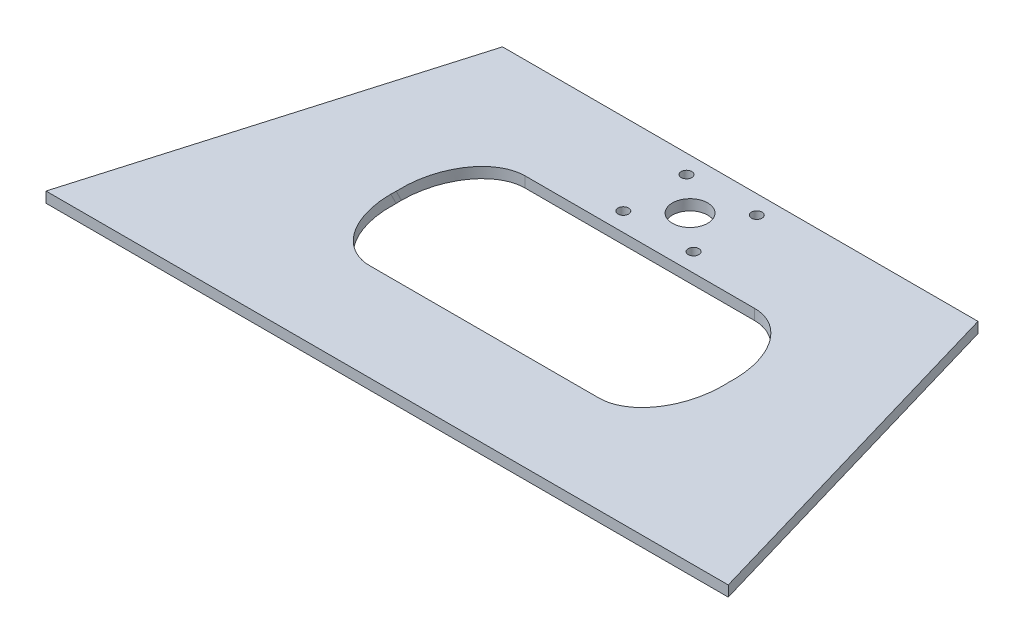
ISO-10303-21;
HEADER;
FILE_DESCRIPTION(('STEP AP214'),'2;1');
FILE_NAME('part.step','',(''),(''),'','','');
FILE_SCHEMA(('AUTOMOTIVE_DESIGN { 1 0 10303 214 1 1 1 1 }'));
ENDSEC;
DATA;
#1=APPLICATION_CONTEXT('core data for automotive mechanical design processes');
#2=APPLICATION_PROTOCOL_DEFINITION('international standard','automotive_design',2000,#1);
#3=PRODUCT_CONTEXT('',#1,'mechanical');
#4=PRODUCT('Part','Part','',(#3));
#5=PRODUCT_RELATED_PRODUCT_CATEGORY('part','',(#4));
#6=PRODUCT_DEFINITION_FORMATION('','',#4);
#7=PRODUCT_DEFINITION_CONTEXT('part definition',#1,'design');
#8=PRODUCT_DEFINITION('design','',#6,#7);
#9=PRODUCT_DEFINITION_SHAPE('','',#8);
#10=(LENGTH_UNIT() NAMED_UNIT(*) SI_UNIT(.MILLI.,.METRE.));
#11=(NAMED_UNIT(*) PLANE_ANGLE_UNIT() SI_UNIT($,.RADIAN.));
#12=(NAMED_UNIT(*) SI_UNIT($,.STERADIAN.) SOLID_ANGLE_UNIT());
#13=UNCERTAINTY_MEASURE_WITH_UNIT(LENGTH_MEASURE(1.E-05),#10,'distance_accuracy_value','');
#14=(GEOMETRIC_REPRESENTATION_CONTEXT(3) GLOBAL_UNCERTAINTY_ASSIGNED_CONTEXT((#13)) GLOBAL_UNIT_ASSIGNED_CONTEXT((#10,
#11,#12)) REPRESENTATION_CONTEXT('',''));
#15=CARTESIAN_POINT('',(0.,0.,0.));
#16=DIRECTION('',(0.,0.,1.));
#17=DIRECTION('',(1.,0.,0.));
#18=AXIS2_PLACEMENT_3D('',#15,#16,#17);
#19=CARTESIAN_POINT('',(0.,3.,0.));
#20=DIRECTION('',(0.,-1.,0.));
#21=DIRECTION('',(0.,0.,-1.));
#22=AXIS2_PLACEMENT_3D('',#19,#20,#21);
#23=PLANE('',#22);
#24=CARTESIAN_POINT('',(86.64996659586,3.,-76.8290118261159));
#25=DIRECTION('',(0.,1.,0.));
#26=DIRECTION('',(0.,0.,1.));
#27=AXIS2_PLACEMENT_3D('',#24,#25,#26);
#28=CIRCLE('',#27,1.5);
#29=CARTESIAN_POINT('',(86.64996659586,3.,-75.3290118261159));
#30=VERTEX_POINT('',#29);
#31=EDGE_CURVE('E337',#30,#30,#28,.T.);
#32=ORIENTED_EDGE('',*,*,#31,.F.);
#33=EDGE_LOOP('',(#32));
#34=FACE_BOUND('',#33,.T.);
#35=DIRECTION('',(1.,0.,0.));
#36=VECTOR('',#35,1.);
#37=CARTESIAN_POINT('',(0.,3.,0.));
#38=LINE('',#37,#36);
#39=CARTESIAN_POINT('',(0.,3.,0.));
#40=VERTEX_POINT('',#39);
#41=CARTESIAN_POINT('',(193.2,3.,0.));
#42=VERTEX_POINT('',#41);
#43=EDGE_CURVE('E94',#40,#42,#38,.T.);
#44=ORIENTED_EDGE('',*,*,#43,.T.);
#45=DIRECTION('',(-0.281001727065255,0.,-0.959707262339066));
#46=VECTOR('',#45,1.);
#47=CARTESIAN_POINT('',(193.2,3.,0.));
#48=LINE('',#47,#46);
#49=CARTESIAN_POINT('',(163.92005828315,3.,-100.));
#50=VERTEX_POINT('',#49);
#51=EDGE_CURVE('E97',#42,#50,#48,.T.);
#52=ORIENTED_EDGE('',*,*,#51,.T.);
#53=DIRECTION('',(-1.,0.,0.));
#54=VECTOR('',#53,1.);
#55=CARTESIAN_POINT('',(29.2799417168491,3.,-100.));
#56=LINE('',#55,#54);
#57=CARTESIAN_POINT('',(29.2799417168491,3.,-100.));
#58=VERTEX_POINT('',#57);
#59=EDGE_CURVE('E53',#50,#58,#56,.T.);
#60=ORIENTED_EDGE('',*,*,#59,.T.);
#61=DIRECTION('',(-0.281001727065247,0.,0.959707262339068));
#62=VECTOR('',#61,1.);
#63=CARTESIAN_POINT('',(0.,3.,0.));
#64=LINE('',#63,#62);
#65=EDGE_CURVE('E100',#58,#40,#64,.T.);
#66=ORIENTED_EDGE('',*,*,#65,.T.);
#67=EDGE_LOOP('',(#44,#52,#60,#66));
#68=FACE_BOUND('',#67,.T.);
#69=CARTESIAN_POINT('',(64.0999999999994,2.99999999999998,-48.0395752908427));
#70=DIRECTION('',(0.,-1.,0.));
#71=DIRECTION('',(0.,0.,1.));
#72=AXIS2_PLACEMENT_3D('',#69,#70,#71);
#73=ELLIPSE('',#72,20.5155954288015,14.5);
#74=CARTESIAN_POINT('',(49.5999999999994,3.,-48.0395752908427));
#75=VERTEX_POINT('',#74);
#76=CARTESIAN_POINT('',(49.6388811468373,3.,-49.5409646205514));
#77=VERTEX_POINT('',#76);
#78=EDGE_CURVE('E208',#75,#77,#73,.T.);
#79=ORIENTED_EDGE('',*,*,#78,.T.);
#80=CARTESIAN_POINT('',(64.0999999999994,3.,-51.04235395026));
#81=DIRECTION('',(0.,-1.,0.));
#82=DIRECTION('',(0.,0.,-1.));
#83=AXIS2_PLACEMENT_3D('',#80,#81,#82);
#84=ELLIPSE('',#83,20.5155954288015,14.5);
#85=CARTESIAN_POINT('',(64.0999999999995,3.,-71.5579493790615));
#86=VERTEX_POINT('',#85);
#87=EDGE_CURVE('E155',#77,#86,#84,.T.);
#88=ORIENTED_EDGE('',*,*,#87,.T.);
#89=DIRECTION('',(1.,0.,0.));
#90=VECTOR('',#89,1.);
#91=CARTESIAN_POINT('',(9.19999999999997,3.,-71.5579493790615));
#92=LINE('',#91,#90);
#93=CARTESIAN_POINT('',(129.1,3.,-71.5579493790615));
#94=VERTEX_POINT('',#93);
#95=EDGE_CURVE('E221',#86,#94,#92,.T.);
#96=ORIENTED_EDGE('',*,*,#95,.T.);
#97=CARTESIAN_POINT('',(129.1,3.,-51.04235395026));
#98=DIRECTION('',(0.,-1.,0.));
#99=DIRECTION('',(0.,0.,-1.));
#100=AXIS2_PLACEMENT_3D('',#97,#98,#99);
#101=ELLIPSE('',#100,20.5155954288015,14.5);
#102=CARTESIAN_POINT('',(143.561118853162,3.,-49.5409646205496));
#103=VERTEX_POINT('',#102);
#104=EDGE_CURVE('E218',#94,#103,#101,.T.);
#105=ORIENTED_EDGE('',*,*,#104,.T.);
#106=CARTESIAN_POINT('',(129.1,2.99999999999998,-48.0395752908427));
#107=DIRECTION('',(0.,-1.,0.));
#108=DIRECTION('',(0.,0.,1.));
#109=AXIS2_PLACEMENT_3D('',#106,#107,#108);
#110=ELLIPSE('',#109,20.5155954288015,14.5);
#111=CARTESIAN_POINT('',(143.6,3.,-48.0395752908427));
#112=VERTEX_POINT('',#111);
#113=EDGE_CURVE('E215',#103,#112,#110,.T.);
#114=ORIENTED_EDGE('',*,*,#113,.T.);
#115=CARTESIAN_POINT('',(129.1,3.,-48.0395752908427));
#116=DIRECTION('',(0.,1.,0.));
#117=DIRECTION('',(0.,0.,-1.));
#118=AXIS2_PLACEMENT_3D('',#115,#116,#117);
#119=ELLIPSE('',#118,20.5155954288014,14.5);
#120=CARTESIAN_POINT('',(129.1,3.,-27.5239798620413));
#121=VERTEX_POINT('',#120);
#122=EDGE_CURVE('E151',#121,#112,#119,.T.);
#123=ORIENTED_EDGE('',*,*,#122,.F.);
#124=DIRECTION('',(-1.,0.,0.));
#125=VECTOR('',#124,1.);
#126=CARTESIAN_POINT('',(96.5999999999995,2.99999999999998,-27.5239798620412));
#127=LINE('',#126,#125);
#128=CARTESIAN_POINT('',(64.0999999999994,3.,-27.5239798620412));
#129=VERTEX_POINT('',#128);
#130=EDGE_CURVE('E212',#121,#129,#127,.T.);
#131=ORIENTED_EDGE('',*,*,#130,.T.);
#132=EDGE_CURVE('E209',#129,#75,#73,.T.);
#133=ORIENTED_EDGE('',*,*,#132,.T.);
#134=EDGE_LOOP('',(#79,#88,#96,#105,#114,#123,#131,#133));
#135=FACE_BOUND('',#134,.T.);
#136=CARTESIAN_POINT('',(96.5999999999996,3.,-85.7789746895308));
#137=DIRECTION('',(0.,1.,0.));
#138=DIRECTION('',(0.,0.,1.));
#139=AXIS2_PLACEMENT_3D('',#136,#137,#138);
#140=CIRCLE('',#139,4.99999999999999);
#141=CARTESIAN_POINT('',(96.5999999999996,3.,-80.7789746895308));
#142=VERTEX_POINT('',#141);
#143=EDGE_CURVE('E354',#142,#142,#140,.T.);
#144=ORIENTED_EDGE('',*,*,#143,.F.);
#145=EDGE_LOOP('',(#144));
#146=FACE_BOUND('',#145,.T.);
#147=CARTESIAN_POINT('',(106.550033404139,3.,-94.7289375529457));
#148=DIRECTION('',(0.,1.,0.));
#149=DIRECTION('',(0.,0.,1.));
#150=AXIS2_PLACEMENT_3D('',#147,#148,#149);
#151=CIRCLE('',#150,1.5);
#152=CARTESIAN_POINT('',(106.550033404139,3.,-93.2289375529457));
#153=VERTEX_POINT('',#152);
#154=EDGE_CURVE('E343',#153,#153,#151,.T.);
#155=ORIENTED_EDGE('',*,*,#154,.F.);
#156=EDGE_LOOP('',(#155));
#157=FACE_BOUND('',#156,.T.);
#158=CARTESIAN_POINT('',(106.549966595721,3.,-76.8289375530703));
#159=DIRECTION('',(0.,1.,0.));
#160=DIRECTION('',(0.,0.,1.));
#161=AXIS2_PLACEMENT_3D('',#158,#159,#160);
#162=CIRCLE('',#161,1.5);
#163=CARTESIAN_POINT('',(106.549966595721,3.,-75.3289375530703));
#164=VERTEX_POINT('',#163);
#165=EDGE_CURVE('E346',#164,#164,#162,.T.);
#166=ORIENTED_EDGE('',*,*,#165,.F.);
#167=EDGE_LOOP('',(#166));
#168=FACE_BOUND('',#167,.T.);
#169=CARTESIAN_POINT('',(86.6500334042779,3.,-94.7290118259911));
#170=DIRECTION('',(0.,1.,0.));
#171=DIRECTION('',(0.,0.,1.));
#172=AXIS2_PLACEMENT_3D('',#169,#170,#171);
#173=CIRCLE('',#172,1.5);
#174=CARTESIAN_POINT('',(86.6500334042779,3.,-93.2290118259911));
#175=VERTEX_POINT('',#174);
#176=EDGE_CURVE('E369',#175,#175,#173,.T.);
#177=ORIENTED_EDGE('',*,*,#176,.F.);
#178=EDGE_LOOP('',(#177));
#179=FACE_BOUND('',#178,.T.);
#180=ADVANCED_FACE('F50',(#34,#68,#135,#146,#157,#168,#179),#23,.F.);
#181=CARTESIAN_POINT('',(0.,3.,0.));
#182=DIRECTION('',(0.959707262339068,0.,0.281001727065248));
#183=DIRECTION('',(0.281001727065248,0.,-0.959707262339068));
#184=AXIS2_PLACEMENT_3D('',#181,#182,#183);
#185=PLANE('',#184);
#186=DIRECTION('',(-0.281001727065247,0.,0.959707262339068));
#187=VECTOR('',#186,1.);
#188=CARTESIAN_POINT('',(0.,0.,0.));
#189=LINE('',#188,#187);
#190=CARTESIAN_POINT('',(29.2799417168491,0.,-100.));
#191=VERTEX_POINT('',#190);
#192=CARTESIAN_POINT('',(0.,0.,0.));
#193=VERTEX_POINT('',#192);
#194=EDGE_CURVE('E13',#191,#193,#189,.T.);
#195=ORIENTED_EDGE('',*,*,#194,.T.);
#196=DIRECTION('',(0.,-1.,0.));
#197=VECTOR('',#196,1.);
#198=CARTESIAN_POINT('',(0.,3.,0.));
#199=LINE('',#198,#197);
#200=EDGE_CURVE('E114',#40,#193,#199,.T.);
#201=ORIENTED_EDGE('',*,*,#200,.F.);
#202=ORIENTED_EDGE('',*,*,#65,.F.);
#203=DIRECTION('',(0.,-1.,0.));
#204=VECTOR('',#203,1.);
#205=CARTESIAN_POINT('',(29.2799417168491,3.,-100.));
#206=LINE('',#205,#204);
#207=EDGE_CURVE('E119',#58,#191,#206,.T.);
#208=ORIENTED_EDGE('',*,*,#207,.T.);
#209=EDGE_LOOP('',(#195,#201,#202,#208));
#210=FACE_BOUND('',#209,.T.);
#211=ADVANCED_FACE('F127',(#210),#185,.F.);
#212=CARTESIAN_POINT('',(0.,3.,0.));
#213=DIRECTION('',(0.,0.,-1.));
#214=DIRECTION('',(-1.,0.,0.));
#215=AXIS2_PLACEMENT_3D('',#212,#213,#214);
#216=PLANE('',#215);
#217=DIRECTION('',(1.,0.,0.));
#218=VECTOR('',#217,1.);
#219=CARTESIAN_POINT('',(0.,0.,0.));
#220=LINE('',#219,#218);
#221=CARTESIAN_POINT('',(193.2,0.,0.));
#222=VERTEX_POINT('',#221);
#223=EDGE_CURVE('E59',#193,#222,#220,.T.);
#224=ORIENTED_EDGE('',*,*,#223,.T.);
#225=DIRECTION('',(0.,-1.,0.));
#226=VECTOR('',#225,1.);
#227=CARTESIAN_POINT('',(193.2,3.,0.));
#228=LINE('',#227,#226);
#229=EDGE_CURVE('E103',#42,#222,#228,.T.);
#230=ORIENTED_EDGE('',*,*,#229,.F.);
#231=ORIENTED_EDGE('',*,*,#43,.F.);
#232=ORIENTED_EDGE('',*,*,#200,.T.);
#233=EDGE_LOOP('',(#224,#230,#231,#232));
#234=FACE_BOUND('',#233,.T.);
#235=ADVANCED_FACE('F104',(#234),#216,.F.);
#236=CARTESIAN_POINT('',(29.2799417168491,3.,-100.));
#237=DIRECTION('',(0.,0.,1.));
#238=DIRECTION('',(1.,0.,0.));
#239=AXIS2_PLACEMENT_3D('',#236,#237,#238);
#240=PLANE('',#239);
#241=ORIENTED_EDGE('',*,*,#59,.F.);
#242=DIRECTION('',(0.,-1.,0.));
#243=VECTOR('',#242,1.);
#244=CARTESIAN_POINT('',(163.92005828315,3.,-100.));
#245=LINE('',#244,#243);
#246=CARTESIAN_POINT('',(163.92005828315,0.,-100.));
#247=VERTEX_POINT('',#246);
#248=EDGE_CURVE('E107',#50,#247,#245,.T.);
#249=ORIENTED_EDGE('',*,*,#248,.T.);
#250=DIRECTION('',(-1.,0.,0.));
#251=VECTOR('',#250,1.);
#252=CARTESIAN_POINT('',(29.2799417168491,0.,-100.));
#253=LINE('',#252,#251);
#254=EDGE_CURVE('E122',#247,#191,#253,.T.);
#255=ORIENTED_EDGE('',*,*,#254,.T.);
#256=ORIENTED_EDGE('',*,*,#207,.F.);
#257=EDGE_LOOP('',(#241,#249,#255,#256));
#258=FACE_BOUND('',#257,.T.);
#259=ADVANCED_FACE('F125',(#258),#240,.F.);
#260=CARTESIAN_POINT('',(0.,0.,0.));
#261=DIRECTION('',(0.,-1.,0.));
#262=DIRECTION('',(0.,0.,-1.));
#263=AXIS2_PLACEMENT_3D('',#260,#261,#262);
#264=PLANE('',#263);
#265=CARTESIAN_POINT('',(86.6500334042779,0.,-94.7290118259911));
#266=DIRECTION('',(0.,-1.,0.));
#267=DIRECTION('',(0.,0.,-1.));
#268=AXIS2_PLACEMENT_3D('',#265,#266,#267);
#269=CIRCLE('',#268,1.5);
#270=CARTESIAN_POINT('',(86.6500334042779,0.,-96.2290118259911));
#271=VERTEX_POINT('',#270);
#272=EDGE_CURVE('E371',#271,#271,#269,.T.);
#273=ORIENTED_EDGE('',*,*,#272,.F.);
#274=EDGE_LOOP('',(#273));
#275=FACE_BOUND('',#274,.T.);
#276=CARTESIAN_POINT('',(106.549966595721,0.,-76.8289375530703));
#277=DIRECTION('',(0.,-1.,0.));
#278=DIRECTION('',(0.,0.,-1.));
#279=AXIS2_PLACEMENT_3D('',#276,#277,#278);
#280=CIRCLE('',#279,1.5);
#281=CARTESIAN_POINT('',(106.549966595721,0.,-78.3289375530703));
#282=VERTEX_POINT('',#281);
#283=EDGE_CURVE('E340',#282,#282,#280,.T.);
#284=ORIENTED_EDGE('',*,*,#283,.F.);
#285=EDGE_LOOP('',(#284));
#286=FACE_BOUND('',#285,.T.);
#287=CARTESIAN_POINT('',(86.64996659586,0.,-76.8290118261159));
#288=DIRECTION('',(0.,-1.,0.));
#289=DIRECTION('',(0.,0.,-1.));
#290=AXIS2_PLACEMENT_3D('',#287,#288,#289);
#291=CIRCLE('',#290,1.5);
#292=CARTESIAN_POINT('',(86.64996659586,0.,-78.3290118261159));
#293=VERTEX_POINT('',#292);
#294=EDGE_CURVE('E339',#293,#293,#291,.T.);
#295=ORIENTED_EDGE('',*,*,#294,.F.);
#296=EDGE_LOOP('',(#295));
#297=FACE_BOUND('',#296,.T.);
#298=CARTESIAN_POINT('',(106.550033404139,0.,-94.7289375529457));
#299=DIRECTION('',(0.,-1.,0.));
#300=DIRECTION('',(0.,0.,-1.));
#301=AXIS2_PLACEMENT_3D('',#298,#299,#300);
#302=CIRCLE('',#301,1.5);
#303=CARTESIAN_POINT('',(106.550033404139,0.,-96.2289375529457));
#304=VERTEX_POINT('',#303);
#305=EDGE_CURVE('E352',#304,#304,#302,.T.);
#306=ORIENTED_EDGE('',*,*,#305,.F.);
#307=EDGE_LOOP('',(#306));
#308=FACE_BOUND('',#307,.T.);
#309=CARTESIAN_POINT('',(96.5999999999996,0.,-85.7789746895308));
#310=DIRECTION('',(0.,-1.,0.));
#311=DIRECTION('',(0.,0.,-1.));
#312=AXIS2_PLACEMENT_3D('',#309,#310,#311);
#313=CIRCLE('',#312,5.);
#314=CARTESIAN_POINT('',(96.5999999999996,0.,-90.7789746895308));
#315=VERTEX_POINT('',#314);
#316=EDGE_CURVE('E168',#315,#315,#313,.T.);
#317=ORIENTED_EDGE('',*,*,#316,.F.);
#318=EDGE_LOOP('',(#317));
#319=FACE_BOUND('',#318,.T.);
#320=ORIENTED_EDGE('',*,*,#254,.F.);
#321=DIRECTION('',(-0.281001727065255,0.,-0.959707262339066));
#322=VECTOR('',#321,1.);
#323=CARTESIAN_POINT('',(193.2,0.,0.));
#324=LINE('',#323,#322);
#325=EDGE_CURVE('E112',#222,#247,#324,.T.);
#326=ORIENTED_EDGE('',*,*,#325,.F.);
#327=ORIENTED_EDGE('',*,*,#223,.F.);
#328=ORIENTED_EDGE('',*,*,#194,.F.);
#329=EDGE_LOOP('',(#320,#326,#327,#328));
#330=FACE_BOUND('',#329,.T.);
#331=CARTESIAN_POINT('',(129.1,0.,-48.0395752908427));
#332=DIRECTION('',(0.,1.,0.));
#333=DIRECTION('',(0.,0.,-1.));
#334=AXIS2_PLACEMENT_3D('',#331,#332,#333);
#335=ELLIPSE('',#334,20.5155954288014,14.5);
#336=CARTESIAN_POINT('',(143.561118853162,0.,-49.5409646205496));
#337=VERTEX_POINT('',#336);
#338=CARTESIAN_POINT('',(129.1,0.,-27.5239798620413));
#339=VERTEX_POINT('',#338);
#340=EDGE_CURVE('E137',#337,#339,#335,.F.);
#341=ORIENTED_EDGE('',*,*,#340,.F.);
#342=CARTESIAN_POINT('',(129.1,0.,-51.04235395026));
#343=DIRECTION('',(0.,-1.,0.));
#344=DIRECTION('',(0.,0.,1.));
#345=AXIS2_PLACEMENT_3D('',#342,#343,#344);
#346=ELLIPSE('',#345,20.5155954288015,14.5);
#347=CARTESIAN_POINT('',(143.6,0.,-51.0423539502601));
#348=VERTEX_POINT('',#347);
#349=EDGE_CURVE('E141',#337,#348,#346,.F.);
#350=ORIENTED_EDGE('',*,*,#349,.T.);
#351=CARTESIAN_POINT('',(129.1,0.,-51.04235395026));
#352=DIRECTION('',(0.,-1.,0.));
#353=DIRECTION('',(0.,0.,-1.));
#354=AXIS2_PLACEMENT_3D('',#351,#352,#353);
#355=ELLIPSE('',#354,20.5155954288015,14.5);
#356=CARTESIAN_POINT('',(129.1,0.,-71.5579493790615));
#357=VERTEX_POINT('',#356);
#358=EDGE_CURVE('E152',#357,#348,#355,.T.);
#359=ORIENTED_EDGE('',*,*,#358,.F.);
#360=DIRECTION('',(1.,0.,0.));
#361=VECTOR('',#360,1.);
#362=CARTESIAN_POINT('',(9.19999999999994,0.,-71.5579493790615));
#363=LINE('',#362,#361);
#364=CARTESIAN_POINT('',(64.0999999999995,0.,-71.5579493790615));
#365=VERTEX_POINT('',#364);
#366=EDGE_CURVE('E158',#365,#357,#363,.T.);
#367=ORIENTED_EDGE('',*,*,#366,.F.);
#368=CARTESIAN_POINT('',(64.0999999999994,0.,-51.04235395026));
#369=DIRECTION('',(0.,-1.,0.));
#370=DIRECTION('',(0.,0.,1.));
#371=AXIS2_PLACEMENT_3D('',#368,#369,#370);
#372=ELLIPSE('',#371,20.5155954288015,14.5);
#373=CARTESIAN_POINT('',(49.5999999999994,0.,-51.04235395026));
#374=VERTEX_POINT('',#373);
#375=EDGE_CURVE('E204',#365,#374,#372,.F.);
#376=ORIENTED_EDGE('',*,*,#375,.T.);
#377=CARTESIAN_POINT('',(49.6388811468372,0.,-49.5409646205544));
#378=VERTEX_POINT('',#377);
#379=EDGE_CURVE('E203',#374,#378,#372,.F.);
#380=ORIENTED_EDGE('',*,*,#379,.T.);
#381=CARTESIAN_POINT('',(64.0999999999994,0.,-48.0395752908427));
#382=DIRECTION('',(0.,1.,0.));
#383=DIRECTION('',(0.,0.,1.));
#384=AXIS2_PLACEMENT_3D('',#381,#382,#383);
#385=ELLIPSE('',#384,20.5155954288015,14.5);
#386=CARTESIAN_POINT('',(64.0999999999994,0.,-27.5239798620412));
#387=VERTEX_POINT('',#386);
#388=EDGE_CURVE('E164',#387,#378,#385,.F.);
#389=ORIENTED_EDGE('',*,*,#388,.F.);
#390=DIRECTION('',(-1.,0.,0.));
#391=VECTOR('',#390,1.);
#392=CARTESIAN_POINT('',(9.19999999999997,0.,-27.5239798620412));
#393=LINE('',#392,#391);
#394=EDGE_CURVE('E145',#339,#387,#393,.T.);
#395=ORIENTED_EDGE('',*,*,#394,.F.);
#396=EDGE_LOOP('',(#341,#350,#359,#367,#376,#380,#389,#395));
#397=FACE_BOUND('',#396,.T.);
#398=ADVANCED_FACE('F128',(#275,#286,#297,#308,#319,#330,#397),#264,.T.);
#399=CARTESIAN_POINT('',(193.2,3.,0.));
#400=DIRECTION('',(-0.959707262339066,0.,0.281001727065255));
#401=DIRECTION('',(0.281001727065255,0.,0.959707262339066));
#402=AXIS2_PLACEMENT_3D('',#399,#400,#401);
#403=PLANE('',#402);
#404=ORIENTED_EDGE('',*,*,#325,.T.);
#405=ORIENTED_EDGE('',*,*,#248,.F.);
#406=ORIENTED_EDGE('',*,*,#51,.F.);
#407=ORIENTED_EDGE('',*,*,#229,.T.);
#408=EDGE_LOOP('',(#404,#405,#406,#407));
#409=FACE_BOUND('',#408,.T.);
#410=ADVANCED_FACE('F110',(#409),#403,.F.);
#411=CARTESIAN_POINT('',(64.0999999999994,-7.,-27.5239798620412));
#412=DIRECTION('',(0.,0.,1.));
#413=DIRECTION('',(1.,0.,0.));
#414=AXIS2_PLACEMENT_3D('',#411,#412,#413);
#415=PLANE('',#414);
#416=ORIENTED_EDGE('',*,*,#394,.T.);
#417=DIRECTION('',(0.,1.,0.));
#418=VECTOR('',#417,1.);
#419=CARTESIAN_POINT('',(64.0999999999994,1.5,-27.5239798620412));
#420=LINE('',#419,#418);
#421=EDGE_CURVE('E196',#387,#129,#420,.T.);
#422=ORIENTED_EDGE('',*,*,#421,.T.);
#423=ORIENTED_EDGE('',*,*,#130,.F.);
#424=DIRECTION('',(0.,1.,0.));
#425=VECTOR('',#424,1.);
#426=CARTESIAN_POINT('',(129.1,-6.99999999999999,-27.5239798620412));
#427=LINE('',#426,#425);
#428=EDGE_CURVE('E195',#339,#121,#427,.T.);
#429=ORIENTED_EDGE('',*,*,#428,.F.);
#430=EDGE_LOOP('',(#416,#422,#423,#429));
#431=FACE_BOUND('',#430,.T.);
#432=ADVANCED_FACE('F180',(#431),#415,.F.);
#433=CARTESIAN_POINT('',(64.0999999999994,-7.,-48.0395752908427));
#434=DIRECTION('',(0.,1.,0.));
#435=DIRECTION('',(0.,0.,1.));
#436=AXIS2_PLACEMENT_3D('',#433,#434,#435);
#437=ELLIPSE('',#436,20.5155954288015,14.5);
#438=DIRECTION('',(0.,1.,0.));
#439=VECTOR('',#438,1.);
#440=SURFACE_OF_LINEAR_EXTRUSION('',#437,#439);
#441=ORIENTED_EDGE('',*,*,#421,.F.);
#442=ORIENTED_EDGE('',*,*,#388,.T.);
#443=CARTESIAN_POINT('',(50.0380503622644,-7.,-53.0442063898716));
#444=CARTESIAN_POINT('',(49.964359717433,-6.17134305892181,-52.6294941618387));
#445=CARTESIAN_POINT('',(49.9002759410238,-5.34201217488287,-52.2144446477376));
#446=CARTESIAN_POINT('',(49.7908220425167,-3.68233696010791,-51.3838384260592));
#447=CARTESIAN_POINT('',(49.7454524806224,-2.85199259977997,-50.9682817036724));
#448=CARTESIAN_POINT('',(49.6729588721765,-1.19130659468814,-50.1371696213148));
#449=CARTESIAN_POINT('',(49.6458209683537,-0.360965428637972,-49.72161450092));
#450=CARTESIAN_POINT('',(49.6094839537083,1.30000680492889,-48.8903591726677));
#451=CARTESIAN_POINT('',(49.6002840885265,2.1306378587854,-48.4746589716466));
#452=CARTESIAN_POINT('',(49.6000021612994,2.97416633493186,-48.0525040872018));
#453=CARTESIAN_POINT('',(49.6000000018856,2.98708317015572,-48.046039687676));
#454=CARTESIAN_POINT('',(49.5999999999993,2.99999999999998,-48.0395752908427));
#455=B_SPLINE_CURVE_WITH_KNOTS('',3,(#443,#444,#445,#446,#447,#448,#449,#450,#451,#452,#453,
#454),.UNSPECIFIED.,.F.,.F.,(4,2,2,2,2,4),(0.,2.78862709260098,5.57733765571683,
8.36392620822776,11.1503975721296,11.1937299828238),.UNSPECIFIED.);
#456=EDGE_CURVE('E187',#378,#75,#455,.T.);
#457=ORIENTED_EDGE('',*,*,#456,.T.);
#458=ORIENTED_EDGE('',*,*,#132,.F.);
#459=EDGE_LOOP('',(#441,#442,#457,#458));
#460=FACE_BOUND('',#459,.T.);
#461=ADVANCED_FACE('F174',(#460),#440,.F.);
#462=CARTESIAN_POINT('',(129.1,-7.,-48.0395752908427));
#463=DIRECTION('',(0.,1.,0.));
#464=DIRECTION('',(0.,0.,-1.));
#465=AXIS2_PLACEMENT_3D('',#462,#463,#464);
#466=ELLIPSE('',#465,20.5155954288014,14.5);
#467=DIRECTION('',(0.,1.,0.));
#468=VECTOR('',#467,1.);
#469=SURFACE_OF_LINEAR_EXTRUSION('',#466,#468);
#470=CARTESIAN_POINT('',(143.161949637735,-7.,-53.0442063898716));
#471=CARTESIAN_POINT('',(143.235640282566,-6.17134305892777,-52.6294941618268));
#472=CARTESIAN_POINT('',(143.299724058975,-5.34201217488583,-52.2144446477316));
#473=CARTESIAN_POINT('',(143.409177957482,-3.68233696010492,-51.3838384260653));
#474=CARTESIAN_POINT('',(143.454547519376,-2.85199259977402,-50.9682817036844));
#475=CARTESIAN_POINT('',(143.527041127822,-1.1913065946942,-50.1371696213029));
#476=CARTESIAN_POINT('',(143.554179031645,-0.360965428658968,-49.7216145008782));
#477=CARTESIAN_POINT('',(143.590516046291,1.30000680494966,-48.8903591727093));
#478=CARTESIAN_POINT('',(143.599715911472,2.13063785886287,-48.4746589718015));
#479=CARTESIAN_POINT('',(143.599997838699,2.97416633493425,-48.0525040872066));
#480=CARTESIAN_POINT('',(143.599999998113,2.98708317015694,-48.0460396876785));
#481=CARTESIAN_POINT('',(143.6,2.99999999999998,-48.0395752908427));
#482=B_SPLINE_CURVE_WITH_KNOTS('',3,(#470,#471,#472,#473,#474,#475,#476,#477,#478,#479,#480,
#481),.UNSPECIFIED.,.F.,.F.,(4,2,2,2,2,4),(0.,2.78862709260098,5.57733765571676,
8.36392620822771,11.1503975721296,11.1937299828238),.UNSPECIFIED.);
#483=EDGE_CURVE('E303',#112,#337,#482,.F.);
#484=ORIENTED_EDGE('',*,*,#483,.T.);
#485=ORIENTED_EDGE('',*,*,#340,.T.);
#486=ORIENTED_EDGE('',*,*,#428,.T.);
#487=ORIENTED_EDGE('',*,*,#122,.T.);
#488=EDGE_LOOP('',(#484,#485,#486,#487));
#489=FACE_BOUND('',#488,.T.);
#490=ADVANCED_FACE('F179',(#489),#469,.F.);
#491=CARTESIAN_POINT('',(64.0999999999994,-40.2845577931788,-91.364224098734));
#492=DIRECTION('',(0.,0.706779388895714,0.707434021964028));
#493=DIRECTION('',(-1.,0.,0.));
#494=AXIS2_PLACEMENT_3D('',#491,#492,#493);
#495=CYLINDRICAL_SURFACE('',#494,14.5);
#496=CARTESIAN_POINT('',(49.6729671137166,4.10732985603375,-48.9867868771124));
#497=CARTESIAN_POINT('',(49.6323572483054,2.96618665367045,-49.5578869527071));
#498=CARTESIAN_POINT('',(49.6087427337426,1.82462857659892,-50.1291946583471));
#499=CARTESIAN_POINT('',(49.6007467828429,0.468254060326865,-50.8080100670137));
#500=CARTESIAN_POINT('',(49.6000782715583,0.253502311625161,-50.9154853950284));
#501=CARTESIAN_POINT('',(49.6000021602187,0.0258336700337781,-51.029425151416));
#502=CARTESIAN_POINT('',(49.6000000008007,0.0129168348698428,-51.0358895509116));
#503=CARTESIAN_POINT('',(49.5999999999994,0.,-51.04235395026));
#504=B_SPLINE_CURVE_WITH_KNOTS('',3,(#496,#497,#498,#499,#500,#501,#502,#503),.UNSPECIFIED.,.F.,
.F.,(4,2,2,4),(0.,3.829880123102,4.55031307091054,4.59364548160471),.UNSPECIFIED.);
#505=EDGE_CURVE('E238',#77,#374,#504,.T.);
#506=ORIENTED_EDGE('',*,*,#505,.F.);
#507=ORIENTED_EDGE('',*,*,#78,.F.);
#508=ORIENTED_EDGE('',*,*,#456,.F.);
#509=ORIENTED_EDGE('',*,*,#379,.F.);
#510=EDGE_LOOP('',(#506,#507,#508,#509));
#511=FACE_BOUND('',#510,.T.);
#512=ADVANCED_FACE('F182',(#511),#495,.F.);
#513=CARTESIAN_POINT('',(64.0999999999994,10.,-51.04235395026));
#514=DIRECTION('',(0.,-1.,0.));
#515=DIRECTION('',(0.,0.,-1.));
#516=AXIS2_PLACEMENT_3D('',#513,#514,#515);
#517=ELLIPSE('',#516,20.5155954288015,14.5);
#518=DIRECTION('',(0.,-1.,0.));
#519=VECTOR('',#518,1.);
#520=SURFACE_OF_LINEAR_EXTRUSION('',#517,#519);
#521=ORIENTED_EDGE('',*,*,#375,.F.);
#522=DIRECTION('',(0.,-1.,0.));
#523=VECTOR('',#522,1.);
#524=CARTESIAN_POINT('',(64.0999999999995,1.5,-71.5579493790615));
#525=LINE('',#524,#523);
#526=EDGE_CURVE('E200',#365,#86,#525,.F.);
#527=ORIENTED_EDGE('',*,*,#526,.T.);
#528=ORIENTED_EDGE('',*,*,#87,.F.);
#529=ORIENTED_EDGE('',*,*,#505,.T.);
#530=EDGE_LOOP('',(#521,#527,#528,#529));
#531=FACE_BOUND('',#530,.T.);
#532=ADVANCED_FACE('F236',(#531),#520,.F.);
#533=CARTESIAN_POINT('',(129.1,10.,-71.5579493790615));
#534=DIRECTION('',(0.,0.,-1.));
#535=DIRECTION('',(-1.,0.,0.));
#536=AXIS2_PLACEMENT_3D('',#533,#534,#535);
#537=PLANE('',#536);
#538=ORIENTED_EDGE('',*,*,#526,.F.);
#539=ORIENTED_EDGE('',*,*,#366,.T.);
#540=DIRECTION('',(0.,-1.,0.));
#541=VECTOR('',#540,1.);
#542=CARTESIAN_POINT('',(129.1,10.,-71.5579493790615));
#543=LINE('',#542,#541);
#544=EDGE_CURVE('E108',#94,#357,#543,.T.);
#545=ORIENTED_EDGE('',*,*,#544,.F.);
#546=ORIENTED_EDGE('',*,*,#95,.F.);
#547=EDGE_LOOP('',(#538,#539,#545,#546));
#548=FACE_BOUND('',#547,.T.);
#549=ADVANCED_FACE('F259',(#548),#537,.F.);
#550=CARTESIAN_POINT('',(129.1,10.,-51.04235395026));
#551=DIRECTION('',(0.,-1.,0.));
#552=DIRECTION('',(0.,0.,-1.));
#553=AXIS2_PLACEMENT_3D('',#550,#551,#552);
#554=ELLIPSE('',#553,20.5155954288015,14.5);
#555=DIRECTION('',(0.,-1.,0.));
#556=VECTOR('',#555,1.);
#557=SURFACE_OF_LINEAR_EXTRUSION('',#554,#556);
#558=ORIENTED_EDGE('',*,*,#104,.F.);
#559=ORIENTED_EDGE('',*,*,#544,.T.);
#560=ORIENTED_EDGE('',*,*,#358,.T.);
#561=CARTESIAN_POINT('',(143.527032886282,4.10732985603376,-48.9867868771124));
#562=CARTESIAN_POINT('',(143.567642751695,2.96618665467747,-49.5578869547174));
#563=CARTESIAN_POINT('',(143.591257266257,1.82462857676761,-50.1291946586804));
#564=CARTESIAN_POINT('',(143.599253217156,0.468254060296802,-50.8080100669501));
#565=CARTESIAN_POINT('',(143.599921728441,0.25350231158661,-50.9154853949498));
#566=CARTESIAN_POINT('',(143.59999783978,0.0258336700292439,-51.0294251514074));
#567=CARTESIAN_POINT('',(143.599999999198,0.0129168348674313,-51.0358895509072));
#568=CARTESIAN_POINT('',(143.6,0.,-51.0423539502601));
#569=B_SPLINE_CURVE_WITH_KNOTS('',3,(#561,#562,#563,#564,#565,#566,#567,#568),.UNSPECIFIED.,.F.,
.F.,(4,2,2,4),(0.,3.8298801230995,4.55031307091073,4.59364548160489),.UNSPECIFIED.);
#570=EDGE_CURVE('E268',#348,#103,#569,.F.);
#571=ORIENTED_EDGE('',*,*,#570,.T.);
#572=EDGE_LOOP('',(#558,#559,#560,#571));
#573=FACE_BOUND('',#572,.T.);
#574=ADVANCED_FACE('F266',(#573),#557,.F.);
#575=CARTESIAN_POINT('',(129.1,-40.2845577931788,-91.364224098734));
#576=DIRECTION('',(0.,0.706779388895714,0.707434021964028));
#577=DIRECTION('',(-1.,0.,0.));
#578=AXIS2_PLACEMENT_3D('',#575,#576,#577);
#579=CYLINDRICAL_SURFACE('',#578,14.5);
#580=ORIENTED_EDGE('',*,*,#570,.F.);
#581=ORIENTED_EDGE('',*,*,#349,.F.);
#582=ORIENTED_EDGE('',*,*,#483,.F.);
#583=ORIENTED_EDGE('',*,*,#113,.F.);
#584=EDGE_LOOP('',(#580,#581,#582,#583));
#585=FACE_BOUND('',#584,.T.);
#586=ADVANCED_FACE('F296',(#585),#579,.F.);
#587=CARTESIAN_POINT('',(96.5999999999996,3.,-85.7789746895308));
#588=DIRECTION('',(0.,1.,0.));
#589=DIRECTION('',(0.,0.,1.));
#590=AXIS2_PLACEMENT_3D('',#587,#588,#589);
#591=CYLINDRICAL_SURFACE('',#590,5.);
#592=ORIENTED_EDGE('',*,*,#143,.T.);
#593=EDGE_LOOP('',(#592));
#594=FACE_BOUND('',#593,.T.);
#595=ORIENTED_EDGE('',*,*,#316,.T.);
#596=EDGE_LOOP('',(#595));
#597=FACE_BOUND('',#596,.T.);
#598=ADVANCED_FACE('F299',(#594,#597),#591,.F.);
#599=CARTESIAN_POINT('',(106.550033404139,3.,-94.7289375529457));
#600=DIRECTION('',(0.,1.,0.));
#601=DIRECTION('',(0.,0.,1.));
#602=AXIS2_PLACEMENT_3D('',#599,#600,#601);
#603=CYLINDRICAL_SURFACE('',#602,1.5);
#604=ORIENTED_EDGE('',*,*,#154,.T.);
#605=EDGE_LOOP('',(#604));
#606=FACE_BOUND('',#605,.T.);
#607=ORIENTED_EDGE('',*,*,#305,.T.);
#608=EDGE_LOOP('',(#607));
#609=FACE_BOUND('',#608,.T.);
#610=ADVANCED_FACE('F327',(#606,#609),#603,.F.);
#611=CARTESIAN_POINT('',(86.64996659586,3.,-76.8290118261159));
#612=DIRECTION('',(0.,1.,0.));
#613=DIRECTION('',(0.,0.,1.));
#614=AXIS2_PLACEMENT_3D('',#611,#612,#613);
#615=CYLINDRICAL_SURFACE('',#614,1.5);
#616=ORIENTED_EDGE('',*,*,#31,.T.);
#617=EDGE_LOOP('',(#616));
#618=FACE_BOUND('',#617,.T.);
#619=ORIENTED_EDGE('',*,*,#294,.T.);
#620=EDGE_LOOP('',(#619));
#621=FACE_BOUND('',#620,.T.);
#622=ADVANCED_FACE('F380',(#618,#621),#615,.F.);
#623=CARTESIAN_POINT('',(106.549966595721,3.,-76.8289375530703));
#624=DIRECTION('',(0.,1.,0.));
#625=DIRECTION('',(0.,0.,1.));
#626=AXIS2_PLACEMENT_3D('',#623,#624,#625);
#627=CYLINDRICAL_SURFACE('',#626,1.5);
#628=ORIENTED_EDGE('',*,*,#165,.T.);
#629=EDGE_LOOP('',(#628));
#630=FACE_BOUND('',#629,.T.);
#631=ORIENTED_EDGE('',*,*,#283,.T.);
#632=EDGE_LOOP('',(#631));
#633=FACE_BOUND('',#632,.T.);
#634=ADVANCED_FACE('F376',(#630,#633),#627,.F.);
#635=CARTESIAN_POINT('',(86.6500334042779,3.,-94.7290118259911));
#636=DIRECTION('',(0.,1.,0.));
#637=DIRECTION('',(0.,0.,1.));
#638=AXIS2_PLACEMENT_3D('',#635,#636,#637);
#639=CYLINDRICAL_SURFACE('',#638,1.5);
#640=ORIENTED_EDGE('',*,*,#176,.T.);
#641=EDGE_LOOP('',(#640));
#642=FACE_BOUND('',#641,.T.);
#643=ORIENTED_EDGE('',*,*,#272,.T.);
#644=EDGE_LOOP('',(#643));
#645=FACE_BOUND('',#644,.T.);
#646=ADVANCED_FACE('F379',(#642,#645),#639,.F.);
#647=CLOSED_SHELL('',(#180,#211,#235,#259,#398,#410,#432,#461,#490,#512,#532,#549,#574,#586,
#598,#610,#622,#634,#646));
#648=MANIFOLD_SOLID_BREP('B2',#647);
#649=ADVANCED_BREP_SHAPE_REPRESENTATION('',(#18,#648),#14);
#650=SHAPE_DEFINITION_REPRESENTATION(#9,#649);
ENDSEC;
END-ISO-10303-21;
